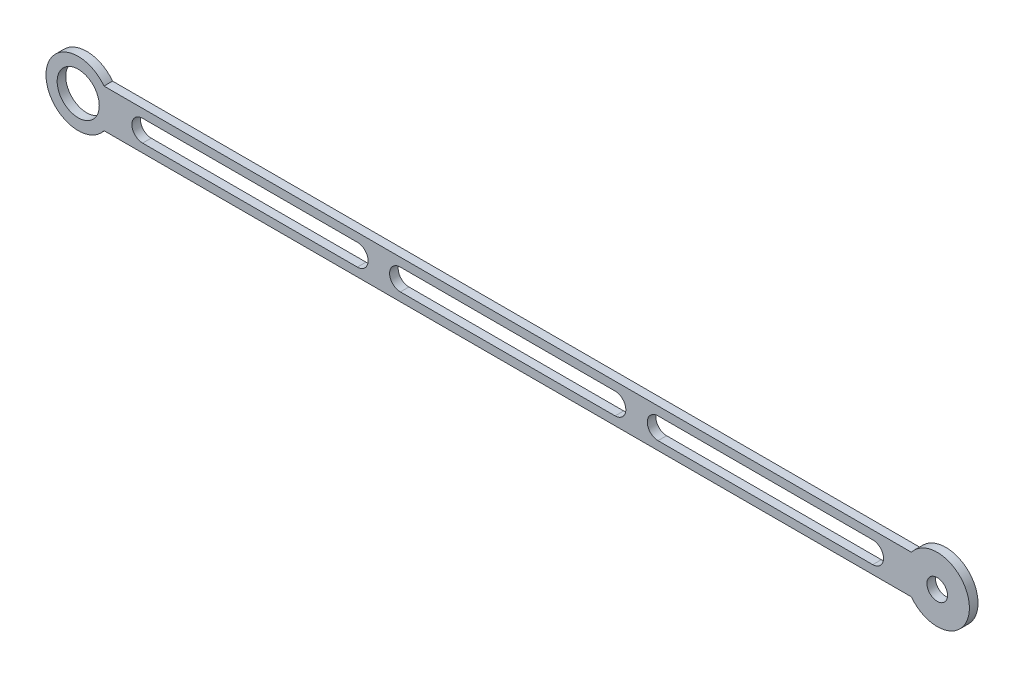
ISO-10303-21;
HEADER;
FILE_DESCRIPTION(('STEP AP214'),'2;1');
FILE_NAME('part.step','',(''),(''),'','','');
FILE_SCHEMA(('AUTOMOTIVE_DESIGN { 1 0 10303 214 1 1 1 1 }'));
ENDSEC;
DATA;
#1=APPLICATION_CONTEXT('core data for automotive mechanical design processes');
#2=APPLICATION_PROTOCOL_DEFINITION('international standard','automotive_design',2000,#1);
#3=PRODUCT_CONTEXT('',#1,'mechanical');
#4=PRODUCT('Part','Part','',(#3));
#5=PRODUCT_RELATED_PRODUCT_CATEGORY('part','',(#4));
#6=PRODUCT_DEFINITION_FORMATION('','',#4);
#7=PRODUCT_DEFINITION_CONTEXT('part definition',#1,'design');
#8=PRODUCT_DEFINITION('design','',#6,#7);
#9=PRODUCT_DEFINITION_SHAPE('','',#8);
#10=(LENGTH_UNIT() NAMED_UNIT(*) SI_UNIT(.MILLI.,.METRE.));
#11=(NAMED_UNIT(*) PLANE_ANGLE_UNIT() SI_UNIT($,.RADIAN.));
#12=(NAMED_UNIT(*) SI_UNIT($,.STERADIAN.) SOLID_ANGLE_UNIT());
#13=UNCERTAINTY_MEASURE_WITH_UNIT(LENGTH_MEASURE(1.E-05),#10,'distance_accuracy_value','');
#14=(GEOMETRIC_REPRESENTATION_CONTEXT(3) GLOBAL_UNCERTAINTY_ASSIGNED_CONTEXT((#13)) GLOBAL_UNIT_ASSIGNED_CONTEXT((#10,
#11,#12)) REPRESENTATION_CONTEXT('',''));
#15=CARTESIAN_POINT('',(0.,0.,0.));
#16=DIRECTION('',(0.,0.,1.));
#17=DIRECTION('',(1.,0.,0.));
#18=AXIS2_PLACEMENT_3D('',#15,#16,#17);
#19=CARTESIAN_POINT('',(0.,-4.5,2.));
#20=DIRECTION('',(0.,1.,0.));
#21=DIRECTION('',(-1.,0.,0.));
#22=AXIS2_PLACEMENT_3D('',#19,#20,#21);
#23=PLANE('',#22);
#24=DIRECTION('',(1.,0.,0.));
#25=VECTOR('',#24,1.);
#26=CARTESIAN_POINT('',(0.,-4.5,0.));
#27=LINE('',#26,#25);
#28=CARTESIAN_POINT('',(6.,-4.5,0.));
#29=VERTEX_POINT('',#28);
#30=CARTESIAN_POINT('',(194.,-4.5,0.));
#31=VERTEX_POINT('',#30);
#32=EDGE_CURVE('E242',#29,#31,#27,.T.);
#33=ORIENTED_EDGE('',*,*,#32,.T.);
#34=DIRECTION('',(0.,0.,-1.));
#35=VECTOR('',#34,1.);
#36=CARTESIAN_POINT('',(194.,-4.5,2.));
#37=LINE('',#36,#35);
#38=CARTESIAN_POINT('',(194.,-4.5,2.));
#39=VERTEX_POINT('',#38);
#40=EDGE_CURVE('E11',#39,#31,#37,.T.);
#41=ORIENTED_EDGE('',*,*,#40,.F.);
#42=DIRECTION('',(1.,0.,0.));
#43=VECTOR('',#42,1.);
#44=CARTESIAN_POINT('',(0.,-4.5,2.));
#45=LINE('',#44,#43);
#46=CARTESIAN_POINT('',(6.,-4.5,2.));
#47=VERTEX_POINT('',#46);
#48=EDGE_CURVE('E249',#47,#39,#45,.T.);
#49=ORIENTED_EDGE('',*,*,#48,.F.);
#50=DIRECTION('',(0.,0.,-1.));
#51=VECTOR('',#50,1.);
#52=CARTESIAN_POINT('',(6.,-4.5,2.));
#53=LINE('',#52,#51);
#54=EDGE_CURVE('E266',#47,#29,#53,.T.);
#55=ORIENTED_EDGE('',*,*,#54,.T.);
#56=EDGE_LOOP('',(#33,#41,#49,#55));
#57=FACE_BOUND('',#56,.T.);
#58=ADVANCED_FACE('F36',(#57),#23,.F.);
#59=CARTESIAN_POINT('',(200.,0.,2.));
#60=DIRECTION('',(0.,0.,-1.));
#61=DIRECTION('',(-1.,0.,0.));
#62=AXIS2_PLACEMENT_3D('',#59,#60,#61);
#63=CYLINDRICAL_SURFACE('',#62,7.50000000000001);
#64=CARTESIAN_POINT('',(200.,0.,0.));
#65=DIRECTION('',(0.,0.,1.));
#66=DIRECTION('',(1.,0.,0.));
#67=AXIS2_PLACEMENT_3D('',#64,#65,#66);
#68=CIRCLE('',#67,7.50000000000001);
#69=CARTESIAN_POINT('',(194.,4.5,0.));
#70=VERTEX_POINT('',#69);
#71=EDGE_CURVE('E269',#31,#70,#68,.T.);
#72=ORIENTED_EDGE('',*,*,#71,.T.);
#73=DIRECTION('',(0.,0.,-1.));
#74=VECTOR('',#73,1.);
#75=CARTESIAN_POINT('',(194.,4.5,2.));
#76=LINE('',#75,#74);
#77=CARTESIAN_POINT('',(194.,4.5,2.));
#78=VERTEX_POINT('',#77);
#79=EDGE_CURVE('E43',#78,#70,#76,.T.);
#80=ORIENTED_EDGE('',*,*,#79,.F.);
#81=CARTESIAN_POINT('',(200.,0.,2.));
#82=DIRECTION('',(0.,0.,1.));
#83=DIRECTION('',(1.,0.,0.));
#84=AXIS2_PLACEMENT_3D('',#81,#82,#83);
#85=CIRCLE('',#84,7.50000000000001);
#86=EDGE_CURVE('E252',#39,#78,#85,.T.);
#87=ORIENTED_EDGE('',*,*,#86,.F.);
#88=ORIENTED_EDGE('',*,*,#40,.T.);
#89=EDGE_LOOP('',(#72,#80,#87,#88));
#90=FACE_BOUND('',#89,.T.);
#91=ADVANCED_FACE('F291',(#90),#63,.T.);
#92=CARTESIAN_POINT('',(0.,4.5,2.));
#93=DIRECTION('',(0.,1.,0.));
#94=DIRECTION('',(-1.,0.,0.));
#95=AXIS2_PLACEMENT_3D('',#92,#93,#94);
#96=PLANE('',#95);
#97=DIRECTION('',(1.,0.,0.));
#98=VECTOR('',#97,1.);
#99=CARTESIAN_POINT('',(0.,4.5,0.));
#100=LINE('',#99,#98);
#101=CARTESIAN_POINT('',(6.,4.5,0.));
#102=VERTEX_POINT('',#101);
#103=EDGE_CURVE('E272',#102,#70,#100,.T.);
#104=ORIENTED_EDGE('',*,*,#103,.F.);
#105=DIRECTION('',(0.,0.,-1.));
#106=VECTOR('',#105,1.);
#107=CARTESIAN_POINT('',(6.,4.5,2.));
#108=LINE('',#107,#106);
#109=CARTESIAN_POINT('',(6.,4.5,2.));
#110=VERTEX_POINT('',#109);
#111=EDGE_CURVE('E284',#110,#102,#108,.T.);
#112=ORIENTED_EDGE('',*,*,#111,.F.);
#113=DIRECTION('',(1.,0.,0.));
#114=VECTOR('',#113,1.);
#115=CARTESIAN_POINT('',(0.,4.5,2.));
#116=LINE('',#115,#114);
#117=EDGE_CURVE('E255',#110,#78,#116,.T.);
#118=ORIENTED_EDGE('',*,*,#117,.T.);
#119=ORIENTED_EDGE('',*,*,#79,.T.);
#120=EDGE_LOOP('',(#104,#112,#118,#119));
#121=FACE_BOUND('',#120,.T.);
#122=ADVANCED_FACE('F288',(#121),#96,.T.);
#123=CARTESIAN_POINT('',(0.,0.,2.));
#124=DIRECTION('',(0.,0.,-1.));
#125=DIRECTION('',(-1.,0.,0.));
#126=AXIS2_PLACEMENT_3D('',#123,#124,#125);
#127=CYLINDRICAL_SURFACE('',#126,4.9);
#128=CARTESIAN_POINT('',(0.,0.,2.));
#129=DIRECTION('',(0.,0.,1.));
#130=DIRECTION('',(1.,0.,0.));
#131=AXIS2_PLACEMENT_3D('',#128,#129,#130);
#132=CIRCLE('',#131,4.9);
#133=CARTESIAN_POINT('',(4.9,0.,2.));
#134=VERTEX_POINT('',#133);
#135=EDGE_CURVE('E260',#134,#134,#132,.T.);
#136=ORIENTED_EDGE('',*,*,#135,.T.);
#137=EDGE_LOOP('',(#136));
#138=FACE_BOUND('',#137,.T.);
#139=CARTESIAN_POINT('',(0.,0.,0.));
#140=DIRECTION('',(0.,0.,1.));
#141=DIRECTION('',(1.,0.,0.));
#142=AXIS2_PLACEMENT_3D('',#139,#140,#141);
#143=CIRCLE('',#142,4.9);
#144=CARTESIAN_POINT('',(4.9,0.,0.));
#145=VERTEX_POINT('',#144);
#146=EDGE_CURVE('E277',#145,#145,#143,.T.);
#147=ORIENTED_EDGE('',*,*,#146,.F.);
#148=EDGE_LOOP('',(#147));
#149=FACE_BOUND('',#148,.T.);
#150=ADVANCED_FACE('F335',(#138,#149),#127,.F.);
#151=CARTESIAN_POINT('',(0.,0.,2.));
#152=DIRECTION('',(0.,0.,-1.));
#153=DIRECTION('',(-1.,0.,0.));
#154=AXIS2_PLACEMENT_3D('',#151,#152,#153);
#155=CYLINDRICAL_SURFACE('',#154,7.5);
#156=CARTESIAN_POINT('',(0.,0.,0.));
#157=DIRECTION('',(0.,0.,1.));
#158=DIRECTION('',(1.,0.,0.));
#159=AXIS2_PLACEMENT_3D('',#156,#157,#158);
#160=CIRCLE('',#159,7.5);
#161=EDGE_CURVE('E275',#102,#29,#160,.T.);
#162=ORIENTED_EDGE('',*,*,#161,.T.);
#163=ORIENTED_EDGE('',*,*,#54,.F.);
#164=CARTESIAN_POINT('',(0.,0.,2.));
#165=DIRECTION('',(0.,0.,1.));
#166=DIRECTION('',(1.,0.,0.));
#167=AXIS2_PLACEMENT_3D('',#164,#165,#166);
#168=CIRCLE('',#167,7.5);
#169=EDGE_CURVE('E258',#110,#47,#168,.T.);
#170=ORIENTED_EDGE('',*,*,#169,.F.);
#171=ORIENTED_EDGE('',*,*,#111,.T.);
#172=EDGE_LOOP('',(#162,#163,#170,#171));
#173=FACE_BOUND('',#172,.T.);
#174=ADVANCED_FACE('F299',(#173),#155,.T.);
#175=CARTESIAN_POINT('',(200.,0.,2.));
#176=DIRECTION('',(0.,0.,-1.));
#177=DIRECTION('',(-1.,0.,0.));
#178=AXIS2_PLACEMENT_3D('',#175,#176,#177);
#179=CYLINDRICAL_SURFACE('',#178,2.4);
#180=CARTESIAN_POINT('',(200.,0.,2.));
#181=DIRECTION('',(0.,0.,1.));
#182=DIRECTION('',(1.,0.,0.));
#183=AXIS2_PLACEMENT_3D('',#180,#181,#182);
#184=CIRCLE('',#183,2.4);
#185=CARTESIAN_POINT('',(202.4,0.,2.));
#186=VERTEX_POINT('',#185);
#187=EDGE_CURVE('E263',#186,#186,#184,.T.);
#188=ORIENTED_EDGE('',*,*,#187,.T.);
#189=EDGE_LOOP('',(#188));
#190=FACE_BOUND('',#189,.T.);
#191=CARTESIAN_POINT('',(200.,0.,0.));
#192=DIRECTION('',(0.,0.,1.));
#193=DIRECTION('',(1.,0.,0.));
#194=AXIS2_PLACEMENT_3D('',#191,#192,#193);
#195=CIRCLE('',#194,2.4);
#196=CARTESIAN_POINT('',(202.4,0.,0.));
#197=VERTEX_POINT('',#196);
#198=EDGE_CURVE('E253',#197,#197,#195,.T.);
#199=ORIENTED_EDGE('',*,*,#198,.F.);
#200=EDGE_LOOP('',(#199));
#201=FACE_BOUND('',#200,.T.);
#202=ADVANCED_FACE('F307',(#190,#201),#179,.F.);
#203=CARTESIAN_POINT('',(0.,0.,2.));
#204=DIRECTION('',(0.,0.,1.));
#205=DIRECTION('',(1.,0.,0.));
#206=AXIS2_PLACEMENT_3D('',#203,#204,#205);
#207=PLANE('',#206);
#208=CARTESIAN_POINT('',(15.,-4.18977760661176E-13,2.));
#209=DIRECTION('',(0.,0.,1.));
#210=DIRECTION('',(1.,0.,0.));
#211=AXIS2_PLACEMENT_3D('',#208,#209,#210);
#212=CIRCLE('',#211,2.49999999999958);
#213=CARTESIAN_POINT('',(15.,2.49999999999958,2.));
#214=VERTEX_POINT('',#213);
#215=CARTESIAN_POINT('',(15.,-2.49999999999958,2.));
#216=VERTEX_POINT('',#215);
#217=EDGE_CURVE('E50',#214,#216,#212,.T.);
#218=ORIENTED_EDGE('',*,*,#217,.F.);
#219=DIRECTION('',(-1.,0.,0.));
#220=VECTOR('',#219,1.);
#221=CARTESIAN_POINT('',(15.,2.49999999999958,2.));
#222=LINE('',#221,#220);
#223=CARTESIAN_POINT('',(65.,2.49999999999958,2.));
#224=VERTEX_POINT('',#223);
#225=EDGE_CURVE('E166',#224,#214,#222,.T.);
#226=ORIENTED_EDGE('',*,*,#225,.F.);
#227=CARTESIAN_POINT('',(65.,-4.09792909667571E-13,2.));
#228=DIRECTION('',(0.,0.,1.));
#229=DIRECTION('',(1.,0.,0.));
#230=AXIS2_PLACEMENT_3D('',#227,#228,#229);
#231=CIRCLE('',#230,2.49999999999958);
#232=CARTESIAN_POINT('',(65.,-2.49999999999999,2.));
#233=VERTEX_POINT('',#232);
#234=EDGE_CURVE('E169',#233,#224,#231,.T.);
#235=ORIENTED_EDGE('',*,*,#234,.F.);
#236=DIRECTION('',(1.,0.,0.));
#237=VECTOR('',#236,1.);
#238=CARTESIAN_POINT('',(15.,-2.49999999999958,2.));
#239=LINE('',#238,#237);
#240=EDGE_CURVE('E175',#216,#233,#239,.T.);
#241=ORIENTED_EDGE('',*,*,#240,.F.);
#242=EDGE_LOOP('',(#218,#226,#235,#241));
#243=FACE_BOUND('',#242,.T.);
#244=CARTESIAN_POINT('',(135.,0.,2.));
#245=DIRECTION('',(0.,0.,1.));
#246=DIRECTION('',(1.,0.,0.));
#247=AXIS2_PLACEMENT_3D('',#244,#245,#246);
#248=CIRCLE('',#247,2.5);
#249=CARTESIAN_POINT('',(135.,2.5,2.));
#250=VERTEX_POINT('',#249);
#251=CARTESIAN_POINT('',(135.,-2.5,2.));
#252=VERTEX_POINT('',#251);
#253=EDGE_CURVE('E181',#250,#252,#248,.T.);
#254=ORIENTED_EDGE('',*,*,#253,.F.);
#255=DIRECTION('',(-1.,0.,0.));
#256=VECTOR('',#255,1.);
#257=CARTESIAN_POINT('',(135.,2.5,2.));
#258=LINE('',#257,#256);
#259=CARTESIAN_POINT('',(185.,2.5,2.));
#260=VERTEX_POINT('',#259);
#261=EDGE_CURVE('E189',#260,#250,#258,.T.);
#262=ORIENTED_EDGE('',*,*,#261,.F.);
#263=CARTESIAN_POINT('',(185.,0.,2.));
#264=DIRECTION('',(0.,0.,1.));
#265=DIRECTION('',(1.,0.,0.));
#266=AXIS2_PLACEMENT_3D('',#263,#264,#265);
#267=CIRCLE('',#266,2.5);
#268=CARTESIAN_POINT('',(185.,-2.49999999999999,2.));
#269=VERTEX_POINT('',#268);
#270=EDGE_CURVE('E203',#269,#260,#267,.T.);
#271=ORIENTED_EDGE('',*,*,#270,.F.);
#272=DIRECTION('',(1.,0.,0.));
#273=VECTOR('',#272,1.);
#274=CARTESIAN_POINT('',(135.,-2.5,2.));
#275=LINE('',#274,#273);
#276=EDGE_CURVE('E200',#252,#269,#275,.T.);
#277=ORIENTED_EDGE('',*,*,#276,.F.);
#278=EDGE_LOOP('',(#254,#262,#271,#277));
#279=FACE_BOUND('',#278,.T.);
#280=CARTESIAN_POINT('',(75.,0.,2.));
#281=DIRECTION('',(0.,0.,1.));
#282=DIRECTION('',(1.,0.,0.));
#283=AXIS2_PLACEMENT_3D('',#280,#281,#282);
#284=CIRCLE('',#283,2.50000000000001);
#285=CARTESIAN_POINT('',(75.,2.50000000000001,2.));
#286=VERTEX_POINT('',#285);
#287=CARTESIAN_POINT('',(75.,-2.50000000000001,2.));
#288=VERTEX_POINT('',#287);
#289=EDGE_CURVE('E210',#286,#288,#284,.T.);
#290=ORIENTED_EDGE('',*,*,#289,.F.);
#291=DIRECTION('',(-1.,0.,0.));
#292=VECTOR('',#291,1.);
#293=CARTESIAN_POINT('',(75.,2.50000000000001,2.));
#294=LINE('',#293,#292);
#295=CARTESIAN_POINT('',(125.,2.50000000000002,2.));
#296=VERTEX_POINT('',#295);
#297=EDGE_CURVE('E221',#296,#286,#294,.T.);
#298=ORIENTED_EDGE('',*,*,#297,.F.);
#299=CARTESIAN_POINT('',(125.,0.,2.));
#300=DIRECTION('',(0.,0.,1.));
#301=DIRECTION('',(1.,0.,0.));
#302=AXIS2_PLACEMENT_3D('',#299,#300,#301);
#303=CIRCLE('',#302,2.50000000000001);
#304=CARTESIAN_POINT('',(125.,-2.5,2.));
#305=VERTEX_POINT('',#304);
#306=EDGE_CURVE('E235',#305,#296,#303,.T.);
#307=ORIENTED_EDGE('',*,*,#306,.F.);
#308=DIRECTION('',(1.,0.,0.));
#309=VECTOR('',#308,1.);
#310=CARTESIAN_POINT('',(75.,-2.50000000000001,2.));
#311=LINE('',#310,#309);
#312=EDGE_CURVE('E232',#288,#305,#311,.T.);
#313=ORIENTED_EDGE('',*,*,#312,.F.);
#314=EDGE_LOOP('',(#290,#298,#307,#313));
#315=FACE_BOUND('',#314,.T.);
#316=ORIENTED_EDGE('',*,*,#48,.T.);
#317=ORIENTED_EDGE('',*,*,#86,.T.);
#318=ORIENTED_EDGE('',*,*,#117,.F.);
#319=ORIENTED_EDGE('',*,*,#169,.T.);
#320=EDGE_LOOP('',(#316,#317,#318,#319));
#321=FACE_BOUND('',#320,.T.);
#322=ORIENTED_EDGE('',*,*,#135,.F.);
#323=EDGE_LOOP('',(#322));
#324=FACE_BOUND('',#323,.T.);
#325=ORIENTED_EDGE('',*,*,#187,.F.);
#326=EDGE_LOOP('',(#325));
#327=FACE_BOUND('',#326,.T.);
#328=ADVANCED_FACE('F304',(#243,#279,#315,#321,#324,#327),#207,.T.);
#329=CARTESIAN_POINT('',(0.,0.,0.));
#330=DIRECTION('',(0.,0.,1.));
#331=DIRECTION('',(1.,0.,0.));
#332=AXIS2_PLACEMENT_3D('',#329,#330,#331);
#333=PLANE('',#332);
#334=DIRECTION('',(-1.,0.,0.));
#335=VECTOR('',#334,1.);
#336=CARTESIAN_POINT('',(15.,2.49999999999958,0.));
#337=LINE('',#336,#335);
#338=CARTESIAN_POINT('',(65.,2.49999999999958,0.));
#339=VERTEX_POINT('',#338);
#340=CARTESIAN_POINT('',(15.,2.49999999999958,0.));
#341=VERTEX_POINT('',#340);
#342=EDGE_CURVE('E156',#339,#341,#337,.T.);
#343=ORIENTED_EDGE('',*,*,#342,.T.);
#344=CARTESIAN_POINT('',(15.,-4.18977760661176E-13,0.));
#345=DIRECTION('',(0.,0.,1.));
#346=DIRECTION('',(1.,0.,0.));
#347=AXIS2_PLACEMENT_3D('',#344,#345,#346);
#348=CIRCLE('',#347,2.49999999999958);
#349=CARTESIAN_POINT('',(15.,-2.49999999999958,0.));
#350=VERTEX_POINT('',#349);
#351=EDGE_CURVE('E150',#341,#350,#348,.T.);
#352=ORIENTED_EDGE('',*,*,#351,.T.);
#353=DIRECTION('',(1.,0.,0.));
#354=VECTOR('',#353,1.);
#355=CARTESIAN_POINT('',(15.,-2.49999999999958,0.));
#356=LINE('',#355,#354);
#357=CARTESIAN_POINT('',(65.,-2.49999999999958,0.));
#358=VERTEX_POINT('',#357);
#359=EDGE_CURVE('E159',#350,#358,#356,.T.);
#360=ORIENTED_EDGE('',*,*,#359,.T.);
#361=CARTESIAN_POINT('',(65.,-4.09792909667571E-13,0.));
#362=DIRECTION('',(0.,0.,1.));
#363=DIRECTION('',(1.,0.,0.));
#364=AXIS2_PLACEMENT_3D('',#361,#362,#363);
#365=CIRCLE('',#364,2.49999999999958);
#366=EDGE_CURVE('E58',#358,#339,#365,.T.);
#367=ORIENTED_EDGE('',*,*,#366,.T.);
#368=EDGE_LOOP('',(#343,#352,#360,#367));
#369=FACE_BOUND('',#368,.T.);
#370=DIRECTION('',(-1.,0.,0.));
#371=VECTOR('',#370,1.);
#372=CARTESIAN_POINT('',(135.,2.5,0.));
#373=LINE('',#372,#371);
#374=CARTESIAN_POINT('',(185.,2.5,0.));
#375=VERTEX_POINT('',#374);
#376=CARTESIAN_POINT('',(135.,2.5,0.));
#377=VERTEX_POINT('',#376);
#378=EDGE_CURVE('E195',#375,#377,#373,.T.);
#379=ORIENTED_EDGE('',*,*,#378,.T.);
#380=CARTESIAN_POINT('',(135.,0.,0.));
#381=DIRECTION('',(0.,0.,1.));
#382=DIRECTION('',(1.,0.,0.));
#383=AXIS2_PLACEMENT_3D('',#380,#381,#382);
#384=CIRCLE('',#383,2.5);
#385=CARTESIAN_POINT('',(135.,-2.5,0.));
#386=VERTEX_POINT('',#385);
#387=EDGE_CURVE('E185',#377,#386,#384,.T.);
#388=ORIENTED_EDGE('',*,*,#387,.T.);
#389=DIRECTION('',(1.,0.,0.));
#390=VECTOR('',#389,1.);
#391=CARTESIAN_POINT('',(135.,-2.5,0.));
#392=LINE('',#391,#390);
#393=CARTESIAN_POINT('',(185.,-2.5,0.));
#394=VERTEX_POINT('',#393);
#395=EDGE_CURVE('E188',#386,#394,#392,.T.);
#396=ORIENTED_EDGE('',*,*,#395,.T.);
#397=CARTESIAN_POINT('',(185.,0.,0.));
#398=DIRECTION('',(0.,0.,1.));
#399=DIRECTION('',(1.,0.,0.));
#400=AXIS2_PLACEMENT_3D('',#397,#398,#399);
#401=CIRCLE('',#400,2.5);
#402=EDGE_CURVE('E192',#394,#375,#401,.T.);
#403=ORIENTED_EDGE('',*,*,#402,.T.);
#404=EDGE_LOOP('',(#379,#388,#396,#403));
#405=FACE_BOUND('',#404,.T.);
#406=DIRECTION('',(-1.,0.,0.));
#407=VECTOR('',#406,1.);
#408=CARTESIAN_POINT('',(75.,2.50000000000001,0.));
#409=LINE('',#408,#407);
#410=CARTESIAN_POINT('',(125.,2.50000000000002,0.));
#411=VERTEX_POINT('',#410);
#412=CARTESIAN_POINT('',(75.,2.50000000000001,0.));
#413=VERTEX_POINT('',#412);
#414=EDGE_CURVE('E227',#411,#413,#409,.T.);
#415=ORIENTED_EDGE('',*,*,#414,.T.);
#416=CARTESIAN_POINT('',(75.,0.,0.));
#417=DIRECTION('',(0.,0.,1.));
#418=DIRECTION('',(1.,0.,0.));
#419=AXIS2_PLACEMENT_3D('',#416,#417,#418);
#420=CIRCLE('',#419,2.50000000000001);
#421=CARTESIAN_POINT('',(75.,-2.50000000000001,0.));
#422=VERTEX_POINT('',#421);
#423=EDGE_CURVE('E217',#413,#422,#420,.T.);
#424=ORIENTED_EDGE('',*,*,#423,.T.);
#425=DIRECTION('',(1.,0.,0.));
#426=VECTOR('',#425,1.);
#427=CARTESIAN_POINT('',(75.,-2.50000000000001,0.));
#428=LINE('',#427,#426);
#429=CARTESIAN_POINT('',(125.,-2.5,0.));
#430=VERTEX_POINT('',#429);
#431=EDGE_CURVE('E220',#422,#430,#428,.T.);
#432=ORIENTED_EDGE('',*,*,#431,.T.);
#433=CARTESIAN_POINT('',(125.,0.,0.));
#434=DIRECTION('',(0.,0.,1.));
#435=DIRECTION('',(1.,0.,0.));
#436=AXIS2_PLACEMENT_3D('',#433,#434,#435);
#437=CIRCLE('',#436,2.50000000000001);
#438=EDGE_CURVE('E224',#430,#411,#437,.T.);
#439=ORIENTED_EDGE('',*,*,#438,.T.);
#440=EDGE_LOOP('',(#415,#424,#432,#439));
#441=FACE_BOUND('',#440,.T.);
#442=ORIENTED_EDGE('',*,*,#32,.F.);
#443=ORIENTED_EDGE('',*,*,#161,.F.);
#444=ORIENTED_EDGE('',*,*,#103,.T.);
#445=ORIENTED_EDGE('',*,*,#71,.F.);
#446=EDGE_LOOP('',(#442,#443,#444,#445));
#447=FACE_BOUND('',#446,.T.);
#448=ORIENTED_EDGE('',*,*,#146,.T.);
#449=EDGE_LOOP('',(#448));
#450=FACE_BOUND('',#449,.T.);
#451=ORIENTED_EDGE('',*,*,#198,.T.);
#452=EDGE_LOOP('',(#451));
#453=FACE_BOUND('',#452,.T.);
#454=ADVANCED_FACE('F163',(#369,#405,#441,#447,#450,#453),#333,.F.);
#455=CARTESIAN_POINT('',(75.,0.,0.));
#456=DIRECTION('',(0.,0.,1.));
#457=DIRECTION('',(1.,0.,0.));
#458=AXIS2_PLACEMENT_3D('',#455,#456,#457);
#459=CYLINDRICAL_SURFACE('',#458,2.50000000000001);
#460=ORIENTED_EDGE('',*,*,#289,.T.);
#461=DIRECTION('',(0.,0.,1.));
#462=VECTOR('',#461,1.);
#463=CARTESIAN_POINT('',(75.,-2.50000000000001,0.));
#464=LINE('',#463,#462);
#465=EDGE_CURVE('E230',#422,#288,#464,.T.);
#466=ORIENTED_EDGE('',*,*,#465,.F.);
#467=ORIENTED_EDGE('',*,*,#423,.F.);
#468=DIRECTION('',(0.,0.,1.));
#469=VECTOR('',#468,1.);
#470=CARTESIAN_POINT('',(75.,2.50000000000001,0.));
#471=LINE('',#470,#469);
#472=EDGE_CURVE('E240',#413,#286,#471,.T.);
#473=ORIENTED_EDGE('',*,*,#472,.T.);
#474=EDGE_LOOP('',(#460,#466,#467,#473));
#475=FACE_BOUND('',#474,.T.);
#476=ADVANCED_FACE('F320',(#475),#459,.F.);
#477=CARTESIAN_POINT('',(75.,2.50000000000001,0.));
#478=DIRECTION('',(0.,1.,0.));
#479=DIRECTION('',(-1.,0.,0.));
#480=AXIS2_PLACEMENT_3D('',#477,#478,#479);
#481=PLANE('',#480);
#482=ORIENTED_EDGE('',*,*,#297,.T.);
#483=ORIENTED_EDGE('',*,*,#472,.F.);
#484=ORIENTED_EDGE('',*,*,#414,.F.);
#485=DIRECTION('',(0.,0.,1.));
#486=VECTOR('',#485,1.);
#487=CARTESIAN_POINT('',(125.,2.50000000000002,0.));
#488=LINE('',#487,#486);
#489=EDGE_CURVE('E243',#411,#296,#488,.T.);
#490=ORIENTED_EDGE('',*,*,#489,.T.);
#491=EDGE_LOOP('',(#482,#483,#484,#490));
#492=FACE_BOUND('',#491,.T.);
#493=ADVANCED_FACE('F325',(#492),#481,.F.);
#494=CARTESIAN_POINT('',(125.,0.,0.));
#495=DIRECTION('',(0.,0.,1.));
#496=DIRECTION('',(1.,0.,0.));
#497=AXIS2_PLACEMENT_3D('',#494,#495,#496);
#498=CYLINDRICAL_SURFACE('',#497,2.50000000000001);
#499=ORIENTED_EDGE('',*,*,#306,.T.);
#500=ORIENTED_EDGE('',*,*,#489,.F.);
#501=ORIENTED_EDGE('',*,*,#438,.F.);
#502=DIRECTION('',(0.,0.,1.));
#503=VECTOR('',#502,1.);
#504=CARTESIAN_POINT('',(125.,-2.5,0.));
#505=LINE('',#504,#503);
#506=EDGE_CURVE('E245',#430,#305,#505,.T.);
#507=ORIENTED_EDGE('',*,*,#506,.T.);
#508=EDGE_LOOP('',(#499,#500,#501,#507));
#509=FACE_BOUND('',#508,.T.);
#510=ADVANCED_FACE('F382',(#509),#498,.F.);
#511=CARTESIAN_POINT('',(75.,-2.50000000000001,0.));
#512=DIRECTION('',(0.,-1.,0.));
#513=DIRECTION('',(1.,0.,0.));
#514=AXIS2_PLACEMENT_3D('',#511,#512,#513);
#515=PLANE('',#514);
#516=ORIENTED_EDGE('',*,*,#312,.T.);
#517=ORIENTED_EDGE('',*,*,#506,.F.);
#518=ORIENTED_EDGE('',*,*,#431,.F.);
#519=ORIENTED_EDGE('',*,*,#465,.T.);
#520=EDGE_LOOP('',(#516,#517,#518,#519));
#521=FACE_BOUND('',#520,.T.);
#522=ADVANCED_FACE('F392',(#521),#515,.F.);
#523=CARTESIAN_POINT('',(135.,0.,0.));
#524=DIRECTION('',(0.,0.,1.));
#525=DIRECTION('',(1.,0.,0.));
#526=AXIS2_PLACEMENT_3D('',#523,#524,#525);
#527=CYLINDRICAL_SURFACE('',#526,2.5);
#528=ORIENTED_EDGE('',*,*,#253,.T.);
#529=DIRECTION('',(0.,0.,1.));
#530=VECTOR('',#529,1.);
#531=CARTESIAN_POINT('',(135.,-2.5,0.));
#532=LINE('',#531,#530);
#533=EDGE_CURVE('E198',#386,#252,#532,.T.);
#534=ORIENTED_EDGE('',*,*,#533,.F.);
#535=ORIENTED_EDGE('',*,*,#387,.F.);
#536=DIRECTION('',(0.,0.,1.));
#537=VECTOR('',#536,1.);
#538=CARTESIAN_POINT('',(135.,2.5,0.));
#539=LINE('',#538,#537);
#540=EDGE_CURVE('E208',#377,#250,#539,.T.);
#541=ORIENTED_EDGE('',*,*,#540,.T.);
#542=EDGE_LOOP('',(#528,#534,#535,#541));
#543=FACE_BOUND('',#542,.T.);
#544=ADVANCED_FACE('F402',(#543),#527,.F.);
#545=CARTESIAN_POINT('',(135.,2.5,0.));
#546=DIRECTION('',(0.,1.,0.));
#547=DIRECTION('',(0.,0.,1.));
#548=AXIS2_PLACEMENT_3D('',#545,#546,#547);
#549=PLANE('',#548);
#550=ORIENTED_EDGE('',*,*,#261,.T.);
#551=ORIENTED_EDGE('',*,*,#540,.F.);
#552=ORIENTED_EDGE('',*,*,#378,.F.);
#553=DIRECTION('',(0.,0.,1.));
#554=VECTOR('',#553,1.);
#555=CARTESIAN_POINT('',(185.,2.5,0.));
#556=LINE('',#555,#554);
#557=EDGE_CURVE('E211',#375,#260,#556,.T.);
#558=ORIENTED_EDGE('',*,*,#557,.T.);
#559=EDGE_LOOP('',(#550,#551,#552,#558));
#560=FACE_BOUND('',#559,.T.);
#561=ADVANCED_FACE('F412',(#560),#549,.F.);
#562=CARTESIAN_POINT('',(185.,0.,0.));
#563=DIRECTION('',(0.,0.,1.));
#564=DIRECTION('',(1.,0.,0.));
#565=AXIS2_PLACEMENT_3D('',#562,#563,#564);
#566=CYLINDRICAL_SURFACE('',#565,2.5);
#567=ORIENTED_EDGE('',*,*,#270,.T.);
#568=ORIENTED_EDGE('',*,*,#557,.F.);
#569=ORIENTED_EDGE('',*,*,#402,.F.);
#570=DIRECTION('',(0.,0.,1.));
#571=VECTOR('',#570,1.);
#572=CARTESIAN_POINT('',(185.,-2.49999999999999,0.));
#573=LINE('',#572,#571);
#574=EDGE_CURVE('E213',#394,#269,#573,.T.);
#575=ORIENTED_EDGE('',*,*,#574,.T.);
#576=EDGE_LOOP('',(#567,#568,#569,#575));
#577=FACE_BOUND('',#576,.T.);
#578=ADVANCED_FACE('F422',(#577),#566,.F.);
#579=CARTESIAN_POINT('',(135.,-2.5,0.));
#580=DIRECTION('',(0.,-1.,0.));
#581=DIRECTION('',(0.,0.,-1.));
#582=AXIS2_PLACEMENT_3D('',#579,#580,#581);
#583=PLANE('',#582);
#584=ORIENTED_EDGE('',*,*,#276,.T.);
#585=ORIENTED_EDGE('',*,*,#574,.F.);
#586=ORIENTED_EDGE('',*,*,#395,.F.);
#587=ORIENTED_EDGE('',*,*,#533,.T.);
#588=EDGE_LOOP('',(#584,#585,#586,#587));
#589=FACE_BOUND('',#588,.T.);
#590=ADVANCED_FACE('F432',(#589),#583,.F.);
#591=CARTESIAN_POINT('',(15.,-4.18977760661176E-13,0.));
#592=DIRECTION('',(0.,0.,1.));
#593=DIRECTION('',(1.,0.,0.));
#594=AXIS2_PLACEMENT_3D('',#591,#592,#593);
#595=CYLINDRICAL_SURFACE('',#594,2.49999999999958);
#596=ORIENTED_EDGE('',*,*,#217,.T.);
#597=DIRECTION('',(0.,0.,1.));
#598=VECTOR('',#597,1.);
#599=CARTESIAN_POINT('',(15.,-2.49999999999958,0.));
#600=LINE('',#599,#598);
#601=EDGE_CURVE('E146',#350,#216,#600,.T.);
#602=ORIENTED_EDGE('',*,*,#601,.F.);
#603=ORIENTED_EDGE('',*,*,#351,.F.);
#604=DIRECTION('',(0.,0.,1.));
#605=VECTOR('',#604,1.);
#606=CARTESIAN_POINT('',(15.,2.49999999999958,0.));
#607=LINE('',#606,#605);
#608=EDGE_CURVE('E179',#341,#214,#607,.T.);
#609=ORIENTED_EDGE('',*,*,#608,.T.);
#610=EDGE_LOOP('',(#596,#602,#603,#609));
#611=FACE_BOUND('',#610,.T.);
#612=ADVANCED_FACE('F148',(#611),#595,.F.);
#613=CARTESIAN_POINT('',(15.,2.49999999999958,0.));
#614=DIRECTION('',(0.,1.,0.));
#615=DIRECTION('',(0.,0.,1.));
#616=AXIS2_PLACEMENT_3D('',#613,#614,#615);
#617=PLANE('',#616);
#618=ORIENTED_EDGE('',*,*,#225,.T.);
#619=ORIENTED_EDGE('',*,*,#608,.F.);
#620=ORIENTED_EDGE('',*,*,#342,.F.);
#621=DIRECTION('',(0.,0.,1.));
#622=VECTOR('',#621,1.);
#623=CARTESIAN_POINT('',(65.,2.49999999999958,0.));
#624=LINE('',#623,#622);
#625=EDGE_CURVE('E182',#339,#224,#624,.T.);
#626=ORIENTED_EDGE('',*,*,#625,.T.);
#627=EDGE_LOOP('',(#618,#619,#620,#626));
#628=FACE_BOUND('',#627,.T.);
#629=ADVANCED_FACE('F451',(#628),#617,.F.);
#630=CARTESIAN_POINT('',(65.,-4.09792909667571E-13,0.));
#631=DIRECTION('',(0.,0.,1.));
#632=DIRECTION('',(1.,0.,0.));
#633=AXIS2_PLACEMENT_3D('',#630,#631,#632);
#634=CYLINDRICAL_SURFACE('',#633,2.49999999999958);
#635=ORIENTED_EDGE('',*,*,#234,.T.);
#636=ORIENTED_EDGE('',*,*,#625,.F.);
#637=ORIENTED_EDGE('',*,*,#366,.F.);
#638=DIRECTION('',(0.,0.,1.));
#639=VECTOR('',#638,1.);
#640=CARTESIAN_POINT('',(65.,-2.49999999999999,0.));
#641=LINE('',#640,#639);
#642=EDGE_CURVE('E155',#358,#233,#641,.T.);
#643=ORIENTED_EDGE('',*,*,#642,.T.);
#644=EDGE_LOOP('',(#635,#636,#637,#643));
#645=FACE_BOUND('',#644,.T.);
#646=ADVANCED_FACE('F460',(#645),#634,.F.);
#647=CARTESIAN_POINT('',(15.,-2.49999999999958,0.));
#648=DIRECTION('',(0.,-1.,0.));
#649=DIRECTION('',(0.,0.,-1.));
#650=AXIS2_PLACEMENT_3D('',#647,#648,#649);
#651=PLANE('',#650);
#652=ORIENTED_EDGE('',*,*,#240,.T.);
#653=ORIENTED_EDGE('',*,*,#642,.F.);
#654=ORIENTED_EDGE('',*,*,#359,.F.);
#655=ORIENTED_EDGE('',*,*,#601,.T.);
#656=EDGE_LOOP('',(#652,#653,#654,#655));
#657=FACE_BOUND('',#656,.T.);
#658=ADVANCED_FACE('F160',(#657),#651,.F.);
#659=CLOSED_SHELL('',(#58,#91,#122,#150,#174,#202,#328,#454,#476,#493,#510,#522,#544,#561,#578,
#590,#612,#629,#646,#658));
#660=MANIFOLD_SOLID_BREP('B2',#659);
#661=ADVANCED_BREP_SHAPE_REPRESENTATION('',(#18,#660),#14);
#662=SHAPE_DEFINITION_REPRESENTATION(#9,#661);
ENDSEC;
END-ISO-10303-21;
